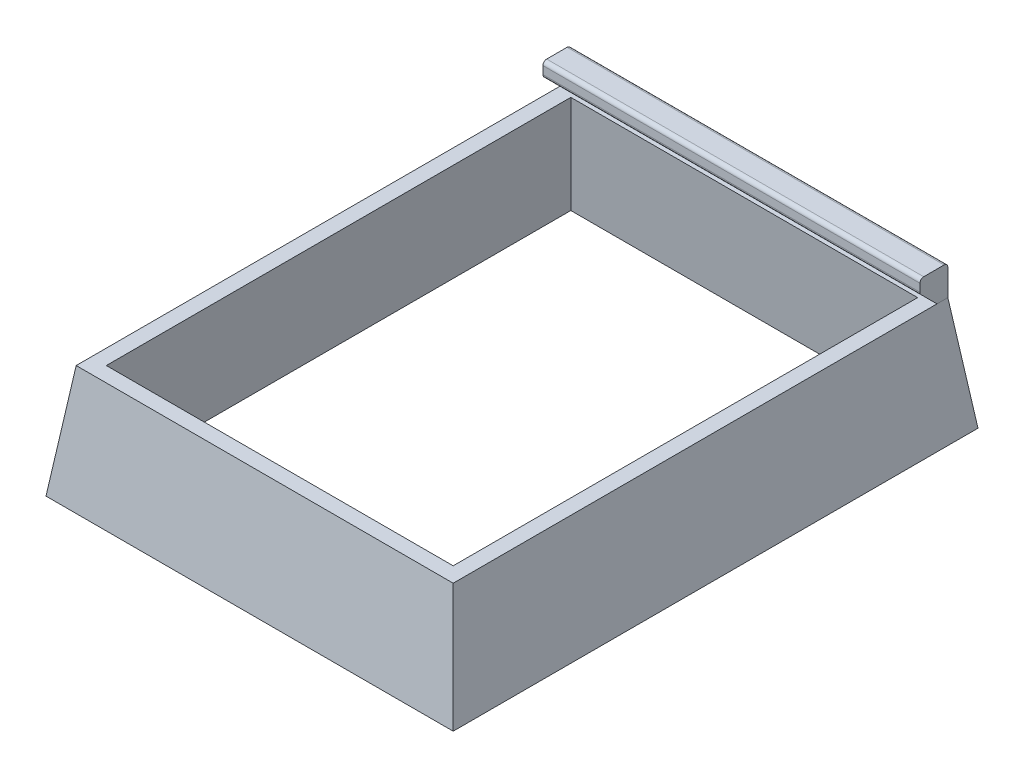
ISO-10303-21;
HEADER;
FILE_DESCRIPTION(('STEP AP214'),'2;1');
FILE_NAME('part.step','',(''),(''),'','','');
FILE_SCHEMA(('AUTOMOTIVE_DESIGN { 1 0 10303 214 1 1 1 1 }'));
ENDSEC;
DATA;
#1=APPLICATION_CONTEXT('core data for automotive mechanical design processes');
#2=APPLICATION_PROTOCOL_DEFINITION('international standard','automotive_design',2000,#1);
#3=PRODUCT_CONTEXT('',#1,'mechanical');
#4=PRODUCT('Part','Part','',(#3));
#5=PRODUCT_RELATED_PRODUCT_CATEGORY('part','',(#4));
#6=PRODUCT_DEFINITION_FORMATION('','',#4);
#7=PRODUCT_DEFINITION_CONTEXT('part definition',#1,'design');
#8=PRODUCT_DEFINITION('design','',#6,#7);
#9=PRODUCT_DEFINITION_SHAPE('','',#8);
#10=(LENGTH_UNIT() NAMED_UNIT(*) SI_UNIT(.MILLI.,.METRE.));
#11=(NAMED_UNIT(*) PLANE_ANGLE_UNIT() SI_UNIT($,.RADIAN.));
#12=(NAMED_UNIT(*) SI_UNIT($,.STERADIAN.) SOLID_ANGLE_UNIT());
#13=UNCERTAINTY_MEASURE_WITH_UNIT(LENGTH_MEASURE(1.E-05),#10,'distance_accuracy_value','');
#14=(GEOMETRIC_REPRESENTATION_CONTEXT(3) GLOBAL_UNCERTAINTY_ASSIGNED_CONTEXT((#13)) GLOBAL_UNIT_ASSIGNED_CONTEXT((#10,
#11,#12)) REPRESENTATION_CONTEXT('',''));
#15=CARTESIAN_POINT('',(0.,0.,0.));
#16=DIRECTION('',(0.,0.,1.));
#17=DIRECTION('',(1.,0.,0.));
#18=AXIS2_PLACEMENT_3D('',#15,#16,#17);
#19=CARTESIAN_POINT('',(25.,35.,-32.8));
#20=DIRECTION('',(0.,1.,0.));
#21=DIRECTION('',(0.,0.,1.));
#22=AXIS2_PLACEMENT_3D('',#19,#20,#21);
#23=PLANE('',#22);
#24=DIRECTION('',(1.,0.,0.));
#25=VECTOR('',#24,1.);
#26=CARTESIAN_POINT('',(-25.,35.,-31.3614439008673));
#27=LINE('',#26,#25);
#28=CARTESIAN_POINT('',(-25.,35.,-31.3614439008673));
#29=VERTEX_POINT('',#28);
#30=CARTESIAN_POINT('',(25.,35.,-31.3614439008673));
#31=VERTEX_POINT('',#30);
#32=EDGE_CURVE('E69',#29,#31,#27,.T.);
#33=ORIENTED_EDGE('',*,*,#32,.F.);
#34=DIRECTION('',(0.,0.,1.));
#35=VECTOR('',#34,1.);
#36=CARTESIAN_POINT('',(-25.,35.,-32.8));
#37=LINE('',#36,#35);
#38=CARTESIAN_POINT('',(-25.,35.,32.8));
#39=VERTEX_POINT('',#38);
#40=EDGE_CURVE('E194',#29,#39,#37,.T.);
#41=ORIENTED_EDGE('',*,*,#40,.T.);
#42=DIRECTION('',(1.,0.,0.));
#43=VECTOR('',#42,1.);
#44=CARTESIAN_POINT('',(-25.,35.,32.8));
#45=LINE('',#44,#43);
#46=CARTESIAN_POINT('',(25.,35.,32.8));
#47=VERTEX_POINT('',#46);
#48=EDGE_CURVE('E119',#39,#47,#45,.T.);
#49=ORIENTED_EDGE('',*,*,#48,.T.);
#50=DIRECTION('',(0.,0.,-1.));
#51=VECTOR('',#50,1.);
#52=CARTESIAN_POINT('',(25.,35.,32.8));
#53=LINE('',#52,#51);
#54=EDGE_CURVE('E303',#47,#31,#53,.T.);
#55=ORIENTED_EDGE('',*,*,#54,.T.);
#56=EDGE_LOOP('',(#33,#41,#49,#55));
#57=FACE_BOUND('',#56,.T.);
#58=DIRECTION('',(1.,0.,0.));
#59=VECTOR('',#58,1.);
#60=CARTESIAN_POINT('',(-23.,35.,30.8));
#61=LINE('',#60,#59);
#62=CARTESIAN_POINT('',(-23.,35.,30.8));
#63=VERTEX_POINT('',#62);
#64=CARTESIAN_POINT('',(23.,35.,30.8));
#65=VERTEX_POINT('',#64);
#66=EDGE_CURVE('E261',#63,#65,#61,.T.);
#67=ORIENTED_EDGE('',*,*,#66,.F.);
#68=DIRECTION('',(0.,0.,1.));
#69=VECTOR('',#68,1.);
#70=CARTESIAN_POINT('',(-23.,35.,-30.8));
#71=LINE('',#70,#69);
#72=CARTESIAN_POINT('',(-23.,35.,-30.8));
#73=VERTEX_POINT('',#72);
#74=EDGE_CURVE('E265',#73,#63,#71,.T.);
#75=ORIENTED_EDGE('',*,*,#74,.F.);
#76=DIRECTION('',(-1.,0.,0.));
#77=VECTOR('',#76,1.);
#78=CARTESIAN_POINT('',(23.,35.,-30.8));
#79=LINE('',#78,#77);
#80=CARTESIAN_POINT('',(23.,35.,-30.8));
#81=VERTEX_POINT('',#80);
#82=EDGE_CURVE('E274',#81,#73,#79,.T.);
#83=ORIENTED_EDGE('',*,*,#82,.F.);
#84=DIRECTION('',(0.,0.,-1.));
#85=VECTOR('',#84,1.);
#86=CARTESIAN_POINT('',(23.,35.,30.8));
#87=LINE('',#86,#85);
#88=EDGE_CURVE('E267',#65,#81,#87,.T.);
#89=ORIENTED_EDGE('',*,*,#88,.F.);
#90=EDGE_LOOP('',(#67,#75,#83,#89));
#91=FACE_BOUND('',#90,.T.);
#92=ADVANCED_FACE('F52',(#57,#91),#23,.T.);
#93=CARTESIAN_POINT('',(-25.,35.,32.8));
#94=DIRECTION('',(0.991227900682635,-0.132163720091018,0.));
#95=DIRECTION('',(0.132163720091018,0.991227900682635,0.));
#96=AXIS2_PLACEMENT_3D('',#93,#94,#95);
#97=PLANE('',#96);
#98=DIRECTION('',(0.131024356416084,0.982682673120627,-0.131024356416084));
#99=VECTOR('',#98,1.);
#100=CARTESIAN_POINT('',(-27.,20.,34.8));
#101=LINE('',#100,#99);
#102=CARTESIAN_POINT('',(-27.,20.,34.8));
#103=VERTEX_POINT('',#102);
#104=EDGE_CURVE('E115',#103,#39,#101,.T.);
#105=ORIENTED_EDGE('',*,*,#104,.T.);
#106=ORIENTED_EDGE('',*,*,#40,.F.);
#107=CARTESIAN_POINT('',(-25.,35.,-32.8));
#108=VERTEX_POINT('',#107);
#109=EDGE_CURVE('E131',#108,#29,#37,.T.);
#110=ORIENTED_EDGE('',*,*,#109,.F.);
#111=DIRECTION('',(0.131024356416084,0.982682673120627,0.131024356416083));
#112=VECTOR('',#111,1.);
#113=CARTESIAN_POINT('',(-27.,20.,-34.8));
#114=LINE('',#113,#112);
#115=CARTESIAN_POINT('',(-27.,20.,-34.8));
#116=VERTEX_POINT('',#115);
#117=EDGE_CURVE('E122',#116,#108,#114,.T.);
#118=ORIENTED_EDGE('',*,*,#117,.F.);
#119=DIRECTION('',(0.,0.,1.));
#120=VECTOR('',#119,1.);
#121=CARTESIAN_POINT('',(-27.,20.,32.8));
#122=LINE('',#121,#120);
#123=EDGE_CURVE('E12',#116,#103,#122,.T.);
#124=ORIENTED_EDGE('',*,*,#123,.T.);
#125=EDGE_LOOP('',(#105,#106,#110,#118,#124));
#126=FACE_BOUND('',#125,.T.);
#127=ADVANCED_FACE('F126',(#126),#97,.F.);
#128=CARTESIAN_POINT('',(-25.,35.,-32.8));
#129=DIRECTION('',(0.,0.132163720091018,-0.991227900682635));
#130=DIRECTION('',(0.,0.991227900682635,0.132163720091018));
#131=AXIS2_PLACEMENT_3D('',#128,#129,#130);
#132=PLANE('',#131);
#133=ORIENTED_EDGE('',*,*,#117,.T.);
#134=DIRECTION('',(1.,0.,0.));
#135=VECTOR('',#134,1.);
#136=CARTESIAN_POINT('',(-25.,35.,-32.8));
#137=LINE('',#136,#135);
#138=CARTESIAN_POINT('',(25.,35.,-32.8));
#139=VERTEX_POINT('',#138);
#140=EDGE_CURVE('E214',#108,#139,#137,.T.);
#141=ORIENTED_EDGE('',*,*,#140,.T.);
#142=DIRECTION('',(-0.131024356416084,0.982682673120627,0.131024356416083));
#143=VECTOR('',#142,1.);
#144=CARTESIAN_POINT('',(27.,20.,-34.8));
#145=LINE('',#144,#143);
#146=CARTESIAN_POINT('',(27.,20.,-34.8));
#147=VERTEX_POINT('',#146);
#148=EDGE_CURVE('E149',#147,#139,#145,.T.);
#149=ORIENTED_EDGE('',*,*,#148,.F.);
#150=DIRECTION('',(1.,0.,0.));
#151=VECTOR('',#150,1.);
#152=CARTESIAN_POINT('',(-25.,20.,-34.8));
#153=LINE('',#152,#151);
#154=EDGE_CURVE('E61',#147,#116,#153,.F.);
#155=ORIENTED_EDGE('',*,*,#154,.T.);
#156=EDGE_LOOP('',(#133,#141,#149,#155));
#157=FACE_BOUND('',#156,.T.);
#158=ADVANCED_FACE('F170',(#157),#132,.T.);
#159=CARTESIAN_POINT('',(25.,35.,32.8));
#160=DIRECTION('',(0.,-0.132163720091019,-0.991227900682635));
#161=DIRECTION('',(0.,0.991227900682635,-0.132163720091019));
#162=AXIS2_PLACEMENT_3D('',#159,#160,#161);
#163=PLANE('',#162);
#164=DIRECTION('',(-0.131024356416084,0.982682673120627,-0.131024356416084));
#165=VECTOR('',#164,1.);
#166=CARTESIAN_POINT('',(27.,20.,34.8));
#167=LINE('',#166,#165);
#168=CARTESIAN_POINT('',(27.,20.,34.8));
#169=VERTEX_POINT('',#168);
#170=EDGE_CURVE('E123',#169,#47,#167,.T.);
#171=ORIENTED_EDGE('',*,*,#170,.T.);
#172=ORIENTED_EDGE('',*,*,#48,.F.);
#173=ORIENTED_EDGE('',*,*,#104,.F.);
#174=DIRECTION('',(1.,0.,0.));
#175=VECTOR('',#174,1.);
#176=CARTESIAN_POINT('',(25.,20.,34.8));
#177=LINE('',#176,#175);
#178=EDGE_CURVE('E103',#103,#169,#177,.T.);
#179=ORIENTED_EDGE('',*,*,#178,.T.);
#180=EDGE_LOOP('',(#171,#172,#173,#179));
#181=FACE_BOUND('',#180,.T.);
#182=ADVANCED_FACE('F116',(#181),#163,.F.);
#183=CARTESIAN_POINT('',(25.,35.,-32.8));
#184=DIRECTION('',(-0.991227900682635,-0.132163720091018,0.));
#185=DIRECTION('',(0.132163720091018,-0.991227900682635,0.));
#186=AXIS2_PLACEMENT_3D('',#183,#184,#185);
#187=PLANE('',#186);
#188=ORIENTED_EDGE('',*,*,#148,.T.);
#189=CARTESIAN_POINT('',(25.,35.,-31.3614439008673));
#190=DIRECTION('',(0.,0.,-1.));
#191=VECTOR('',#190,1.);
#192=LINE('',#189,#191);
#193=EDGE_CURVE('E324',#31,#139,#192,.T.);
#194=ORIENTED_EDGE('',*,*,#193,.F.);
#195=ORIENTED_EDGE('',*,*,#54,.F.);
#196=ORIENTED_EDGE('',*,*,#170,.F.);
#197=DIRECTION('',(0.,0.,1.));
#198=VECTOR('',#197,1.);
#199=CARTESIAN_POINT('',(27.,20.,-32.8));
#200=LINE('',#199,#198);
#201=EDGE_CURVE('E107',#169,#147,#200,.F.);
#202=ORIENTED_EDGE('',*,*,#201,.T.);
#203=EDGE_LOOP('',(#188,#194,#195,#196,#202));
#204=FACE_BOUND('',#203,.T.);
#205=ADVANCED_FACE('F238',(#204),#187,.F.);
#206=CARTESIAN_POINT('',(-23.,35.,30.8));
#207=DIRECTION('',(0.991227900682635,-0.132163720091018,0.));
#208=DIRECTION('',(0.132163720091018,0.991227900682635,0.));
#209=AXIS2_PLACEMENT_3D('',#206,#207,#208);
#210=PLANE('',#209);
#211=DIRECTION('',(0.131024356416084,0.982682673120627,-0.131024356416084));
#212=VECTOR('',#211,1.);
#213=CARTESIAN_POINT('',(-25.,20.,32.8));
#214=LINE('',#213,#212);
#215=CARTESIAN_POINT('',(-25.,20.,32.8));
#216=VERTEX_POINT('',#215);
#217=EDGE_CURVE('E371',#216,#63,#214,.T.);
#218=ORIENTED_EDGE('',*,*,#217,.F.);
#219=DIRECTION('',(0.,0.,-1.));
#220=VECTOR('',#219,1.);
#221=CARTESIAN_POINT('',(-25.,20.,-36.4140962761126));
#222=LINE('',#221,#220);
#223=CARTESIAN_POINT('',(-25.,20.,-32.8));
#224=VERTEX_POINT('',#223);
#225=EDGE_CURVE('E138',#224,#216,#222,.F.);
#226=ORIENTED_EDGE('',*,*,#225,.F.);
#227=DIRECTION('',(0.131024356416084,0.982682673120628,0.131024356416084));
#228=VECTOR('',#227,1.);
#229=CARTESIAN_POINT('',(-25.,20.,-32.8));
#230=LINE('',#229,#228);
#231=EDGE_CURVE('E368',#224,#73,#230,.T.);
#232=ORIENTED_EDGE('',*,*,#231,.T.);
#233=ORIENTED_EDGE('',*,*,#74,.T.);
#234=EDGE_LOOP('',(#218,#226,#232,#233));
#235=FACE_BOUND('',#234,.T.);
#236=ADVANCED_FACE('F234',(#235),#210,.T.);
#237=CARTESIAN_POINT('',(-23.,35.,-30.8));
#238=DIRECTION('',(0.,-0.132163720091018,0.991227900682635));
#239=DIRECTION('',(0.,-0.991227900682635,-0.132163720091018));
#240=AXIS2_PLACEMENT_3D('',#237,#238,#239);
#241=PLANE('',#240);
#242=ORIENTED_EDGE('',*,*,#231,.F.);
#243=DIRECTION('',(1.,0.,0.));
#244=VECTOR('',#243,1.);
#245=CARTESIAN_POINT('',(-28.5921362750545,20.,-32.8));
#246=LINE('',#245,#244);
#247=CARTESIAN_POINT('',(25.,20.,-32.8));
#248=VERTEX_POINT('',#247);
#249=EDGE_CURVE('E136',#248,#224,#246,.F.);
#250=ORIENTED_EDGE('',*,*,#249,.F.);
#251=DIRECTION('',(-0.131024356416084,0.982682673120627,0.131024356416083));
#252=VECTOR('',#251,1.);
#253=CARTESIAN_POINT('',(25.,20.,-32.8));
#254=LINE('',#253,#252);
#255=EDGE_CURVE('E272',#248,#81,#254,.T.);
#256=ORIENTED_EDGE('',*,*,#255,.T.);
#257=ORIENTED_EDGE('',*,*,#82,.T.);
#258=EDGE_LOOP('',(#242,#250,#256,#257));
#259=FACE_BOUND('',#258,.T.);
#260=ADVANCED_FACE('F237',(#259),#241,.T.);
#261=CARTESIAN_POINT('',(23.,35.,30.8));
#262=DIRECTION('',(0.,-0.132163720091018,-0.991227900682635));
#263=DIRECTION('',(0.,0.991227900682635,-0.132163720091018));
#264=AXIS2_PLACEMENT_3D('',#261,#262,#263);
#265=PLANE('',#264);
#266=DIRECTION('',(-0.131024356416084,0.982682673120627,-0.131024356416084));
#267=VECTOR('',#266,1.);
#268=CARTESIAN_POINT('',(25.,20.,32.8));
#269=LINE('',#268,#267);
#270=CARTESIAN_POINT('',(25.,20.,32.8));
#271=VERTEX_POINT('',#270);
#272=EDGE_CURVE('E375',#271,#65,#269,.T.);
#273=ORIENTED_EDGE('',*,*,#272,.F.);
#274=DIRECTION('',(1.,0.,0.));
#275=VECTOR('',#274,1.);
#276=CARTESIAN_POINT('',(-28.5921362750545,20.,32.8));
#277=LINE('',#276,#275);
#278=EDGE_CURVE('E389',#216,#271,#277,.T.);
#279=ORIENTED_EDGE('',*,*,#278,.F.);
#280=ORIENTED_EDGE('',*,*,#217,.T.);
#281=ORIENTED_EDGE('',*,*,#66,.T.);
#282=EDGE_LOOP('',(#273,#279,#280,#281));
#283=FACE_BOUND('',#282,.T.);
#284=ADVANCED_FACE('F241',(#283),#265,.T.);
#285=CARTESIAN_POINT('',(23.,35.,-30.8));
#286=DIRECTION('',(-0.991227900682635,-0.132163720091018,0.));
#287=DIRECTION('',(0.132163720091018,-0.991227900682635,0.));
#288=AXIS2_PLACEMENT_3D('',#285,#286,#287);
#289=PLANE('',#288);
#290=ORIENTED_EDGE('',*,*,#255,.F.);
#291=DIRECTION('',(0.,0.,-1.));
#292=VECTOR('',#291,1.);
#293=CARTESIAN_POINT('',(25.,20.,-36.4140962761126));
#294=LINE('',#293,#292);
#295=EDGE_CURVE('E111',#271,#248,#294,.T.);
#296=ORIENTED_EDGE('',*,*,#295,.F.);
#297=ORIENTED_EDGE('',*,*,#272,.T.);
#298=ORIENTED_EDGE('',*,*,#88,.T.);
#299=EDGE_LOOP('',(#290,#296,#297,#298));
#300=FACE_BOUND('',#299,.T.);
#301=ADVANCED_FACE('F171',(#300),#289,.T.);
#302=CARTESIAN_POINT('',(-25.,37.1149972914606,-29.2464466094067));
#303=DIRECTION('',(0.,-0.707106781186547,0.707106781186547));
#304=DIRECTION('',(0.,-0.707106781186548,-0.707106781186548));
#305=AXIS2_PLACEMENT_3D('',#302,#303,#304);
#306=PLANE('',#305);
#307=DIRECTION('',(0.,-0.707106781186547,-0.707106781186547));
#308=VECTOR('',#307,1.);
#309=CARTESIAN_POINT('',(25.,37.1149972914606,-29.2464466094067));
#310=LINE('',#309,#308);
#311=CARTESIAN_POINT('',(25.,37.1149972914606,-29.2464466094067));
#312=VERTEX_POINT('',#311);
#313=EDGE_CURVE('E208',#312,#31,#310,.T.);
#314=ORIENTED_EDGE('',*,*,#313,.F.);
#315=DIRECTION('',(1.,0.,0.));
#316=VECTOR('',#315,1.);
#317=CARTESIAN_POINT('',(-25.,37.1149972914606,-29.2464466094067));
#318=LINE('',#317,#316);
#319=CARTESIAN_POINT('',(-25.,37.1149972914606,-29.2464466094067));
#320=VERTEX_POINT('',#319);
#321=EDGE_CURVE('E337',#320,#312,#318,.T.);
#322=ORIENTED_EDGE('',*,*,#321,.F.);
#323=DIRECTION('',(0.,-0.707106781186547,-0.707106781186547));
#324=VECTOR('',#323,1.);
#325=CARTESIAN_POINT('',(-25.,37.1149972914606,-29.2464466094067));
#326=LINE('',#325,#324);
#327=EDGE_CURVE('E336',#320,#29,#326,.T.);
#328=ORIENTED_EDGE('',*,*,#327,.T.);
#329=ORIENTED_EDGE('',*,*,#32,.T.);
#330=EDGE_LOOP('',(#314,#322,#328,#329));
#331=FACE_BOUND('',#330,.T.);
#332=ADVANCED_FACE('F247',(#331),#306,.T.);
#333=CARTESIAN_POINT('',(-25.,37.4685506820539,-29.6));
#334=DIRECTION('',(1.,0.,0.));
#335=DIRECTION('',(0.,0.,-1.));
#336=AXIS2_PLACEMENT_3D('',#333,#334,#335);
#337=CYLINDRICAL_SURFACE('',#336,0.499999999999998);
#338=CARTESIAN_POINT('',(25.,37.4685506820539,-29.6));
#339=DIRECTION('',(1.,0.,0.));
#340=DIRECTION('',(0.,0.,1.));
#341=AXIS2_PLACEMENT_3D('',#338,#339,#340);
#342=CIRCLE('',#341,0.499999999999998);
#343=CARTESIAN_POINT('',(25.,37.4685506820539,-29.1));
#344=VERTEX_POINT('',#343);
#345=EDGE_CURVE('E343',#344,#312,#342,.T.);
#346=ORIENTED_EDGE('',*,*,#345,.F.);
#347=DIRECTION('',(1.,0.,0.));
#348=VECTOR('',#347,1.);
#349=CARTESIAN_POINT('',(-25.,37.4685506820539,-29.1));
#350=LINE('',#349,#348);
#351=CARTESIAN_POINT('',(-25.,37.4685506820539,-29.1));
#352=VERTEX_POINT('',#351);
#353=EDGE_CURVE('E354',#352,#344,#350,.T.);
#354=ORIENTED_EDGE('',*,*,#353,.F.);
#355=CARTESIAN_POINT('',(-25.,37.4685506820539,-29.6));
#356=DIRECTION('',(1.,0.,0.));
#357=DIRECTION('',(0.,0.,1.));
#358=AXIS2_PLACEMENT_3D('',#355,#356,#357);
#359=CIRCLE('',#358,0.499999999999998);
#360=EDGE_CURVE('E487',#352,#320,#359,.T.);
#361=ORIENTED_EDGE('',*,*,#360,.T.);
#362=ORIENTED_EDGE('',*,*,#321,.T.);
#363=EDGE_LOOP('',(#346,#354,#361,#362));
#364=FACE_BOUND('',#363,.T.);
#365=ADVANCED_FACE('F455',(#364),#337,.T.);
#366=CARTESIAN_POINT('',(-25.,38.5,-29.1));
#367=DIRECTION('',(0.,0.,1.));
#368=DIRECTION('',(1.,0.,0.));
#369=AXIS2_PLACEMENT_3D('',#366,#367,#368);
#370=PLANE('',#369);
#371=DIRECTION('',(0.,-1.,0.));
#372=VECTOR('',#371,1.);
#373=CARTESIAN_POINT('',(25.,38.5,-29.1));
#374=LINE('',#373,#372);
#375=CARTESIAN_POINT('',(25.,38.5,-29.1));
#376=VERTEX_POINT('',#375);
#377=EDGE_CURVE('E345',#376,#344,#374,.T.);
#378=ORIENTED_EDGE('',*,*,#377,.F.);
#379=DIRECTION('',(1.,0.,0.));
#380=VECTOR('',#379,1.);
#381=CARTESIAN_POINT('',(-25.,38.5,-29.1));
#382=LINE('',#381,#380);
#383=CARTESIAN_POINT('',(-25.,38.5,-29.1));
#384=VERTEX_POINT('',#383);
#385=EDGE_CURVE('E357',#384,#376,#382,.T.);
#386=ORIENTED_EDGE('',*,*,#385,.F.);
#387=DIRECTION('',(0.,-1.,0.));
#388=VECTOR('',#387,1.);
#389=CARTESIAN_POINT('',(-25.,38.5,-29.1));
#390=LINE('',#389,#388);
#391=EDGE_CURVE('E484',#384,#352,#390,.T.);
#392=ORIENTED_EDGE('',*,*,#391,.T.);
#393=ORIENTED_EDGE('',*,*,#353,.T.);
#394=EDGE_LOOP('',(#378,#386,#392,#393));
#395=FACE_BOUND('',#394,.T.);
#396=ADVANCED_FACE('F458',(#395),#370,.T.);
#397=CARTESIAN_POINT('',(-25.,38.5,-29.6));
#398=DIRECTION('',(1.,0.,0.));
#399=DIRECTION('',(0.,0.,-1.));
#400=AXIS2_PLACEMENT_3D('',#397,#398,#399);
#401=CYLINDRICAL_SURFACE('',#400,0.499999999999999);
#402=CARTESIAN_POINT('',(25.,38.5,-29.6));
#403=DIRECTION('',(1.,0.,0.));
#404=DIRECTION('',(0.,0.,-1.));
#405=AXIS2_PLACEMENT_3D('',#402,#403,#404);
#406=CIRCLE('',#405,0.499999999999999);
#407=CARTESIAN_POINT('',(25.,39.,-29.6));
#408=VERTEX_POINT('',#407);
#409=EDGE_CURVE('E477',#408,#376,#406,.T.);
#410=ORIENTED_EDGE('',*,*,#409,.F.);
#411=DIRECTION('',(1.,0.,0.));
#412=VECTOR('',#411,1.);
#413=CARTESIAN_POINT('',(-25.,39.,-29.6));
#414=LINE('',#413,#412);
#415=CARTESIAN_POINT('',(-25.,39.,-29.6));
#416=VERTEX_POINT('',#415);
#417=EDGE_CURVE('E360',#416,#408,#414,.T.);
#418=ORIENTED_EDGE('',*,*,#417,.F.);
#419=CARTESIAN_POINT('',(-25.,38.5,-29.6));
#420=DIRECTION('',(1.,0.,0.));
#421=DIRECTION('',(0.,0.,-1.));
#422=AXIS2_PLACEMENT_3D('',#419,#420,#421);
#423=CIRCLE('',#422,0.499999999999999);
#424=EDGE_CURVE('E490',#416,#384,#423,.T.);
#425=ORIENTED_EDGE('',*,*,#424,.T.);
#426=ORIENTED_EDGE('',*,*,#385,.T.);
#427=EDGE_LOOP('',(#410,#418,#425,#426));
#428=FACE_BOUND('',#427,.T.);
#429=ADVANCED_FACE('F462',(#428),#401,.T.);
#430=CARTESIAN_POINT('',(-25.,39.,-32.3));
#431=DIRECTION('',(0.,1.,0.));
#432=DIRECTION('',(0.,0.,1.));
#433=AXIS2_PLACEMENT_3D('',#430,#431,#432);
#434=PLANE('',#433);
#435=DIRECTION('',(0.,0.,1.));
#436=VECTOR('',#435,1.);
#437=CARTESIAN_POINT('',(25.,39.,-32.3));
#438=LINE('',#437,#436);
#439=CARTESIAN_POINT('',(25.,39.,-32.3));
#440=VERTEX_POINT('',#439);
#441=EDGE_CURVE('E436',#440,#408,#438,.T.);
#442=ORIENTED_EDGE('',*,*,#441,.F.);
#443=DIRECTION('',(1.,0.,0.));
#444=VECTOR('',#443,1.);
#445=CARTESIAN_POINT('',(-25.,39.,-32.3));
#446=LINE('',#445,#444);
#447=CARTESIAN_POINT('',(-25.,39.,-32.3));
#448=VERTEX_POINT('',#447);
#449=EDGE_CURVE('E363',#448,#440,#446,.T.);
#450=ORIENTED_EDGE('',*,*,#449,.F.);
#451=DIRECTION('',(0.,0.,1.));
#452=VECTOR('',#451,1.);
#453=CARTESIAN_POINT('',(-25.,39.,-32.3));
#454=LINE('',#453,#452);
#455=EDGE_CURVE('E434',#448,#416,#454,.T.);
#456=ORIENTED_EDGE('',*,*,#455,.T.);
#457=ORIENTED_EDGE('',*,*,#417,.T.);
#458=EDGE_LOOP('',(#442,#450,#456,#457));
#459=FACE_BOUND('',#458,.T.);
#460=ADVANCED_FACE('F465',(#459),#434,.T.);
#461=CARTESIAN_POINT('',(-25.,38.5,-32.3));
#462=DIRECTION('',(1.,0.,0.));
#463=DIRECTION('',(0.,0.,-1.));
#464=AXIS2_PLACEMENT_3D('',#461,#462,#463);
#465=CYLINDRICAL_SURFACE('',#464,0.5);
#466=CARTESIAN_POINT('',(25.,38.5,-32.3));
#467=DIRECTION('',(1.,0.,0.));
#468=DIRECTION('',(0.,0.,-1.));
#469=AXIS2_PLACEMENT_3D('',#466,#467,#468);
#470=CIRCLE('',#469,0.5);
#471=CARTESIAN_POINT('',(25.,38.5,-32.8));
#472=VERTEX_POINT('',#471);
#473=EDGE_CURVE('E429',#472,#440,#470,.T.);
#474=ORIENTED_EDGE('',*,*,#473,.F.);
#475=DIRECTION('',(1.,0.,0.));
#476=VECTOR('',#475,1.);
#477=CARTESIAN_POINT('',(-25.,38.5,-32.8));
#478=LINE('',#477,#476);
#479=CARTESIAN_POINT('',(-25.,38.5,-32.8));
#480=VERTEX_POINT('',#479);
#481=EDGE_CURVE('E366',#480,#472,#478,.T.);
#482=ORIENTED_EDGE('',*,*,#481,.F.);
#483=CARTESIAN_POINT('',(-25.,38.5,-32.3));
#484=DIRECTION('',(1.,0.,0.));
#485=DIRECTION('',(0.,0.,-1.));
#486=AXIS2_PLACEMENT_3D('',#483,#484,#485);
#487=CIRCLE('',#486,0.5);
#488=EDGE_CURVE('E207',#480,#448,#487,.T.);
#489=ORIENTED_EDGE('',*,*,#488,.T.);
#490=ORIENTED_EDGE('',*,*,#449,.T.);
#491=EDGE_LOOP('',(#474,#482,#489,#490));
#492=FACE_BOUND('',#491,.T.);
#493=ADVANCED_FACE('F232',(#492),#465,.T.);
#494=CARTESIAN_POINT('',(-25.,35.,-32.8));
#495=DIRECTION('',(0.,0.,-1.));
#496=DIRECTION('',(-1.,0.,0.));
#497=AXIS2_PLACEMENT_3D('',#494,#495,#496);
#498=PLANE('',#497);
#499=DIRECTION('',(0.,1.,0.));
#500=VECTOR('',#499,1.);
#501=CARTESIAN_POINT('',(25.,35.,-32.8));
#502=LINE('',#501,#500);
#503=EDGE_CURVE('E330',#139,#472,#502,.T.);
#504=ORIENTED_EDGE('',*,*,#503,.F.);
#505=ORIENTED_EDGE('',*,*,#140,.F.);
#506=DIRECTION('',(0.,1.,0.));
#507=VECTOR('',#506,1.);
#508=CARTESIAN_POINT('',(-25.,35.,-32.8));
#509=LINE('',#508,#507);
#510=EDGE_CURVE('E204',#108,#480,#509,.T.);
#511=ORIENTED_EDGE('',*,*,#510,.T.);
#512=ORIENTED_EDGE('',*,*,#481,.T.);
#513=EDGE_LOOP('',(#504,#505,#511,#512));
#514=FACE_BOUND('',#513,.T.);
#515=ADVANCED_FACE('F221',(#514),#498,.T.);
#516=CARTESIAN_POINT('',(-25.,37.4685506820539,-29.6));
#517=DIRECTION('',(-1.,0.,0.));
#518=DIRECTION('',(0.,0.,1.));
#519=AXIS2_PLACEMENT_3D('',#516,#517,#518);
#520=PLANE('',#519);
#521=ORIENTED_EDGE('',*,*,#109,.T.);
#522=ORIENTED_EDGE('',*,*,#327,.F.);
#523=ORIENTED_EDGE('',*,*,#360,.F.);
#524=ORIENTED_EDGE('',*,*,#391,.F.);
#525=ORIENTED_EDGE('',*,*,#424,.F.);
#526=ORIENTED_EDGE('',*,*,#455,.F.);
#527=ORIENTED_EDGE('',*,*,#488,.F.);
#528=ORIENTED_EDGE('',*,*,#510,.F.);
#529=EDGE_LOOP('',(#521,#522,#523,#524,#525,#526,#527,#528));
#530=FACE_BOUND('',#529,.T.);
#531=ADVANCED_FACE('F231',(#530),#520,.T.);
#532=CARTESIAN_POINT('',(25.,37.4685506820539,-29.6));
#533=DIRECTION('',(-1.,0.,0.));
#534=DIRECTION('',(0.,0.,1.));
#535=AXIS2_PLACEMENT_3D('',#532,#533,#534);
#536=PLANE('',#535);
#537=ORIENTED_EDGE('',*,*,#193,.T.);
#538=ORIENTED_EDGE('',*,*,#503,.T.);
#539=ORIENTED_EDGE('',*,*,#473,.T.);
#540=ORIENTED_EDGE('',*,*,#441,.T.);
#541=ORIENTED_EDGE('',*,*,#409,.T.);
#542=ORIENTED_EDGE('',*,*,#377,.T.);
#543=ORIENTED_EDGE('',*,*,#345,.T.);
#544=ORIENTED_EDGE('',*,*,#313,.T.);
#545=EDGE_LOOP('',(#537,#538,#539,#540,#541,#542,#543,#544));
#546=FACE_BOUND('',#545,.T.);
#547=ADVANCED_FACE('F340',(#546),#536,.F.);
#548=CARTESIAN_POINT('',(-28.5921362750545,20.,-36.4140962761126));
#549=DIRECTION('',(0.,-1.,0.));
#550=DIRECTION('',(0.,0.,-1.));
#551=AXIS2_PLACEMENT_3D('',#548,#549,#550);
#552=PLANE('',#551);
#553=ORIENTED_EDGE('',*,*,#278,.T.);
#554=ORIENTED_EDGE('',*,*,#295,.T.);
#555=ORIENTED_EDGE('',*,*,#249,.T.);
#556=ORIENTED_EDGE('',*,*,#225,.T.);
#557=EDGE_LOOP('',(#553,#554,#555,#556));
#558=FACE_BOUND('',#557,.T.);
#559=ORIENTED_EDGE('',*,*,#123,.F.);
#560=ORIENTED_EDGE('',*,*,#154,.F.);
#561=ORIENTED_EDGE('',*,*,#201,.F.);
#562=ORIENTED_EDGE('',*,*,#178,.F.);
#563=EDGE_LOOP('',(#559,#560,#561,#562));
#564=FACE_BOUND('',#563,.T.);
#565=ADVANCED_FACE('F105',(#558,#564),#552,.T.);
#566=CLOSED_SHELL('',(#92,#127,#158,#182,#205,#236,#260,#284,#301,#332,#365,#396,#429,#460,#493,
#515,#531,#547,#565));
#567=MANIFOLD_SOLID_BREP('B2',#566);
#568=ADVANCED_BREP_SHAPE_REPRESENTATION('',(#18,#567),#14);
#569=SHAPE_DEFINITION_REPRESENTATION(#9,#568);
ENDSEC;
END-ISO-10303-21;
